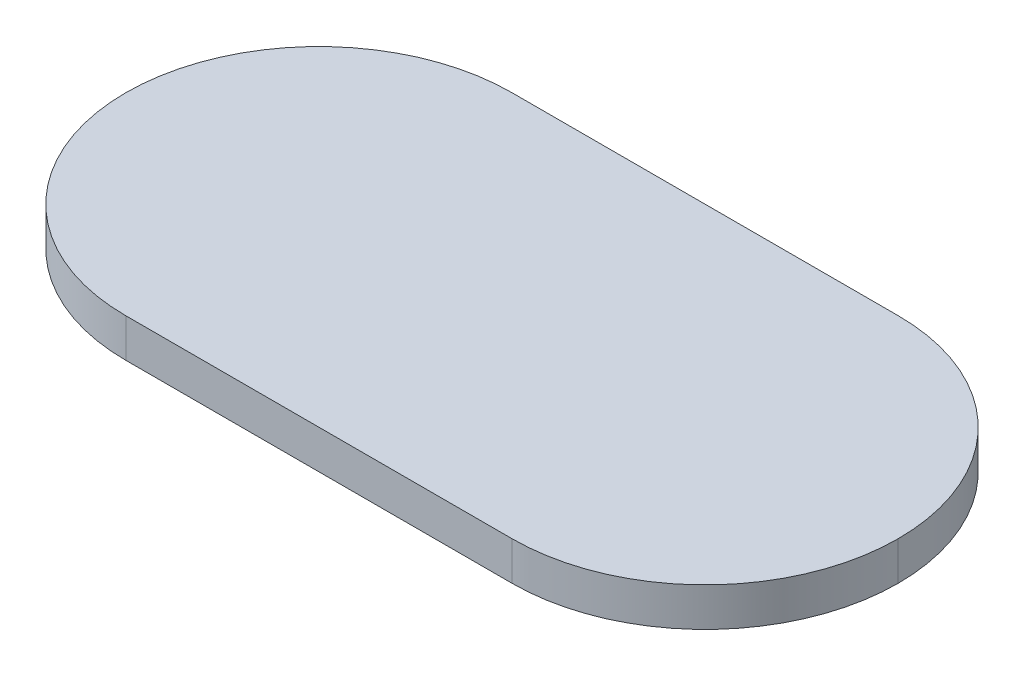
ISO-10303-21;
HEADER;
FILE_DESCRIPTION(('STEP AP214'),'2;1');
FILE_NAME('part.step','',(''),(''),'','','');
FILE_SCHEMA(('AUTOMOTIVE_DESIGN { 1 0 10303 214 1 1 1 1 }'));
ENDSEC;
DATA;
#1=APPLICATION_CONTEXT('core data for automotive mechanical design processes');
#2=APPLICATION_PROTOCOL_DEFINITION('international standard','automotive_design',2000,#1);
#3=PRODUCT_CONTEXT('',#1,'mechanical');
#4=PRODUCT('Part','Part','',(#3));
#5=PRODUCT_RELATED_PRODUCT_CATEGORY('part','',(#4));
#6=PRODUCT_DEFINITION_FORMATION('','',#4);
#7=PRODUCT_DEFINITION_CONTEXT('part definition',#1,'design');
#8=PRODUCT_DEFINITION('design','',#6,#7);
#9=PRODUCT_DEFINITION_SHAPE('','',#8);
#10=(LENGTH_UNIT() NAMED_UNIT(*) SI_UNIT(.MILLI.,.METRE.));
#11=(NAMED_UNIT(*) PLANE_ANGLE_UNIT() SI_UNIT($,.RADIAN.));
#12=(NAMED_UNIT(*) SI_UNIT($,.STERADIAN.) SOLID_ANGLE_UNIT());
#13=UNCERTAINTY_MEASURE_WITH_UNIT(LENGTH_MEASURE(1.E-05),#10,'distance_accuracy_value','');
#14=(GEOMETRIC_REPRESENTATION_CONTEXT(3) GLOBAL_UNCERTAINTY_ASSIGNED_CONTEXT((#13)) GLOBAL_UNIT_ASSIGNED_CONTEXT((#10,
#11,#12)) REPRESENTATION_CONTEXT('',''));
#15=CARTESIAN_POINT('',(0.,0.,0.));
#16=DIRECTION('',(0.,0.,1.));
#17=DIRECTION('',(1.,0.,0.));
#18=AXIS2_PLACEMENT_3D('',#15,#16,#17);
#19=CARTESIAN_POINT('',(-100.,10.,-50.));
#20=DIRECTION('',(0.,0.,1.));
#21=DIRECTION('',(1.,0.,0.));
#22=AXIS2_PLACEMENT_3D('',#19,#20,#21);
#23=PLANE('',#22);
#24=DIRECTION('',(-1.,0.,0.));
#25=VECTOR('',#24,1.);
#26=CARTESIAN_POINT('',(-100.,10.,-50.));
#27=LINE('',#26,#25);
#28=CARTESIAN_POINT('',(50.,10.,-50.));
#29=VERTEX_POINT('',#28);
#30=CARTESIAN_POINT('',(-50.,10.,-50.));
#31=VERTEX_POINT('',#30);
#32=EDGE_CURVE('E110',#29,#31,#27,.T.);
#33=ORIENTED_EDGE('',*,*,#32,.F.);
#34=DIRECTION('',(0.,-1.,0.));
#35=VECTOR('',#34,1.);
#36=CARTESIAN_POINT('',(50.,10.,-50.));
#37=LINE('',#36,#35);
#38=CARTESIAN_POINT('',(50.,0.,-50.));
#39=VERTEX_POINT('',#38);
#40=EDGE_CURVE('E95',#29,#39,#37,.T.);
#41=ORIENTED_EDGE('',*,*,#40,.T.);
#42=DIRECTION('',(-1.,0.,0.));
#43=VECTOR('',#42,1.);
#44=CARTESIAN_POINT('',(-100.,0.,-50.));
#45=LINE('',#44,#43);
#46=CARTESIAN_POINT('',(-50.,0.,-50.));
#47=VERTEX_POINT('',#46);
#48=EDGE_CURVE('E107',#39,#47,#45,.T.);
#49=ORIENTED_EDGE('',*,*,#48,.T.);
#50=DIRECTION('',(0.,-1.,0.));
#51=VECTOR('',#50,1.);
#52=CARTESIAN_POINT('',(-50.,10.,-50.));
#53=LINE('',#52,#51);
#54=EDGE_CURVE('E112',#47,#31,#53,.F.);
#55=ORIENTED_EDGE('',*,*,#54,.T.);
#56=EDGE_LOOP('',(#33,#41,#49,#55));
#57=FACE_BOUND('',#56,.T.);
#58=ADVANCED_FACE('F37',(#57),#23,.F.);
#59=CARTESIAN_POINT('',(-100.,10.,50.));
#60=DIRECTION('',(0.,0.,-1.));
#61=DIRECTION('',(-1.,0.,0.));
#62=AXIS2_PLACEMENT_3D('',#59,#60,#61);
#63=PLANE('',#62);
#64=DIRECTION('',(1.,0.,0.));
#65=VECTOR('',#64,1.);
#66=CARTESIAN_POINT('',(-100.,0.,50.));
#67=LINE('',#66,#65);
#68=CARTESIAN_POINT('',(-50.,0.,50.));
#69=VERTEX_POINT('',#68);
#70=CARTESIAN_POINT('',(50.,0.,50.));
#71=VERTEX_POINT('',#70);
#72=EDGE_CURVE('E116',#69,#71,#67,.T.);
#73=ORIENTED_EDGE('',*,*,#72,.T.);
#74=DIRECTION('',(0.,-1.,0.));
#75=VECTOR('',#74,1.);
#76=CARTESIAN_POINT('',(50.,10.,50.));
#77=LINE('',#76,#75);
#78=CARTESIAN_POINT('',(50.,10.,50.));
#79=VERTEX_POINT('',#78);
#80=EDGE_CURVE('E11',#71,#79,#77,.F.);
#81=ORIENTED_EDGE('',*,*,#80,.T.);
#82=DIRECTION('',(1.,0.,0.));
#83=VECTOR('',#82,1.);
#84=CARTESIAN_POINT('',(-100.,10.,50.));
#85=LINE('',#84,#83);
#86=CARTESIAN_POINT('',(-50.,10.,50.));
#87=VERTEX_POINT('',#86);
#88=EDGE_CURVE('E120',#87,#79,#85,.T.);
#89=ORIENTED_EDGE('',*,*,#88,.F.);
#90=DIRECTION('',(0.,-1.,0.));
#91=VECTOR('',#90,1.);
#92=CARTESIAN_POINT('',(-50.,10.,50.));
#93=LINE('',#92,#91);
#94=EDGE_CURVE('E46',#87,#69,#93,.T.);
#95=ORIENTED_EDGE('',*,*,#94,.T.);
#96=EDGE_LOOP('',(#73,#81,#89,#95));
#97=FACE_BOUND('',#96,.T.);
#98=ADVANCED_FACE('F137',(#97),#63,.F.);
#99=CARTESIAN_POINT('',(0.,10.,0.));
#100=DIRECTION('',(0.,1.,0.));
#101=DIRECTION('',(0.,0.,1.));
#102=AXIS2_PLACEMENT_3D('',#99,#100,#101);
#103=PLANE('',#102);
#104=CARTESIAN_POINT('',(50.,10.,0.));
#105=DIRECTION('',(0.,1.,0.));
#106=DIRECTION('',(0.,0.,1.));
#107=AXIS2_PLACEMENT_3D('',#104,#105,#106);
#108=CIRCLE('',#107,50.);
#109=CARTESIAN_POINT('',(100.,10.,0.));
#110=VERTEX_POINT('',#109);
#111=EDGE_CURVE('E130',#79,#110,#108,.T.);
#112=ORIENTED_EDGE('',*,*,#111,.T.);
#113=CARTESIAN_POINT('',(50.,10.,0.));
#114=DIRECTION('',(0.,1.,0.));
#115=DIRECTION('',(0.,0.,1.));
#116=AXIS2_PLACEMENT_3D('',#113,#114,#115);
#117=CIRCLE('',#116,50.);
#118=EDGE_CURVE('E132',#110,#29,#117,.T.);
#119=ORIENTED_EDGE('',*,*,#118,.T.);
#120=ORIENTED_EDGE('',*,*,#32,.T.);
#121=CARTESIAN_POINT('',(-50.,10.,0.));
#122=DIRECTION('',(0.,1.,0.));
#123=DIRECTION('',(0.,0.,1.));
#124=AXIS2_PLACEMENT_3D('',#121,#122,#123);
#125=CIRCLE('',#124,50.);
#126=CARTESIAN_POINT('',(-100.,10.,0.));
#127=VERTEX_POINT('',#126);
#128=EDGE_CURVE('E101',#31,#127,#125,.T.);
#129=ORIENTED_EDGE('',*,*,#128,.T.);
#130=CARTESIAN_POINT('',(-50.,10.,0.));
#131=DIRECTION('',(0.,1.,0.));
#132=DIRECTION('',(0.,0.,1.));
#133=AXIS2_PLACEMENT_3D('',#130,#131,#132);
#134=CIRCLE('',#133,50.);
#135=EDGE_CURVE('E59',#127,#87,#134,.T.);
#136=ORIENTED_EDGE('',*,*,#135,.T.);
#137=ORIENTED_EDGE('',*,*,#88,.T.);
#138=EDGE_LOOP('',(#112,#119,#120,#129,#136,#137));
#139=FACE_BOUND('',#138,.T.);
#140=ADVANCED_FACE('F142',(#139),#103,.T.);
#141=CARTESIAN_POINT('',(0.,0.,0.));
#142=DIRECTION('',(0.,1.,0.));
#143=DIRECTION('',(0.,0.,1.));
#144=AXIS2_PLACEMENT_3D('',#141,#142,#143);
#145=PLANE('',#144);
#146=ORIENTED_EDGE('',*,*,#48,.F.);
#147=CARTESIAN_POINT('',(50.,0.,0.));
#148=DIRECTION('',(0.,1.,0.));
#149=DIRECTION('',(0.,0.,1.));
#150=AXIS2_PLACEMENT_3D('',#147,#148,#149);
#151=CIRCLE('',#150,50.);
#152=CARTESIAN_POINT('',(100.,0.,0.));
#153=VERTEX_POINT('',#152);
#154=EDGE_CURVE('E91',#39,#153,#151,.F.);
#155=ORIENTED_EDGE('',*,*,#154,.T.);
#156=CARTESIAN_POINT('',(50.,0.,0.));
#157=DIRECTION('',(0.,1.,0.));
#158=DIRECTION('',(0.,0.,1.));
#159=AXIS2_PLACEMENT_3D('',#156,#157,#158);
#160=CIRCLE('',#159,50.);
#161=EDGE_CURVE('E102',#153,#71,#160,.F.);
#162=ORIENTED_EDGE('',*,*,#161,.T.);
#163=ORIENTED_EDGE('',*,*,#72,.F.);
#164=CARTESIAN_POINT('',(-50.,0.,0.));
#165=DIRECTION('',(0.,1.,0.));
#166=DIRECTION('',(0.,0.,1.));
#167=AXIS2_PLACEMENT_3D('',#164,#165,#166);
#168=CIRCLE('',#167,50.);
#169=CARTESIAN_POINT('',(-100.,0.,0.));
#170=VERTEX_POINT('',#169);
#171=EDGE_CURVE('E125',#69,#170,#168,.F.);
#172=ORIENTED_EDGE('',*,*,#171,.T.);
#173=CARTESIAN_POINT('',(-50.,0.,0.));
#174=DIRECTION('',(0.,1.,0.));
#175=DIRECTION('',(0.,0.,1.));
#176=AXIS2_PLACEMENT_3D('',#173,#174,#175);
#177=CIRCLE('',#176,50.);
#178=EDGE_CURVE('E111',#170,#47,#177,.F.);
#179=ORIENTED_EDGE('',*,*,#178,.T.);
#180=EDGE_LOOP('',(#146,#155,#162,#163,#172,#179));
#181=FACE_BOUND('',#180,.T.);
#182=ADVANCED_FACE('F114',(#181),#145,.F.);
#183=CARTESIAN_POINT('',(50.,10.,0.));
#184=DIRECTION('',(0.,-1.,0.));
#185=DIRECTION('',(0.,0.,-1.));
#186=AXIS2_PLACEMENT_3D('',#183,#184,#185);
#187=CYLINDRICAL_SURFACE('',#186,50.);
#188=DIRECTION('',(0.,-1.,0.));
#189=VECTOR('',#188,1.);
#190=CARTESIAN_POINT('',(100.,10.,0.));
#191=LINE('',#190,#189);
#192=EDGE_CURVE('E97',#110,#153,#191,.T.);
#193=ORIENTED_EDGE('',*,*,#192,.F.);
#194=ORIENTED_EDGE('',*,*,#111,.F.);
#195=ORIENTED_EDGE('',*,*,#80,.F.);
#196=ORIENTED_EDGE('',*,*,#161,.F.);
#197=EDGE_LOOP('',(#193,#194,#195,#196));
#198=FACE_BOUND('',#197,.T.);
#199=ADVANCED_FACE('F140',(#198),#187,.T.);
#200=CARTESIAN_POINT('',(50.,10.,0.));
#201=DIRECTION('',(0.,-1.,0.));
#202=DIRECTION('',(0.,0.,-1.));
#203=AXIS2_PLACEMENT_3D('',#200,#201,#202);
#204=CYLINDRICAL_SURFACE('',#203,50.);
#205=ORIENTED_EDGE('',*,*,#118,.F.);
#206=ORIENTED_EDGE('',*,*,#192,.T.);
#207=ORIENTED_EDGE('',*,*,#154,.F.);
#208=ORIENTED_EDGE('',*,*,#40,.F.);
#209=EDGE_LOOP('',(#205,#206,#207,#208));
#210=FACE_BOUND('',#209,.T.);
#211=ADVANCED_FACE('F94',(#210),#204,.T.);
#212=CARTESIAN_POINT('',(-50.,10.,0.));
#213=DIRECTION('',(0.,-1.,0.));
#214=DIRECTION('',(0.,0.,-1.));
#215=AXIS2_PLACEMENT_3D('',#212,#213,#214);
#216=CYLINDRICAL_SURFACE('',#215,50.);
#217=DIRECTION('',(0.,-1.,0.));
#218=VECTOR('',#217,1.);
#219=CARTESIAN_POINT('',(-100.,10.,0.));
#220=LINE('',#219,#218);
#221=EDGE_CURVE('E41',#127,#170,#220,.T.);
#222=ORIENTED_EDGE('',*,*,#221,.F.);
#223=ORIENTED_EDGE('',*,*,#128,.F.);
#224=ORIENTED_EDGE('',*,*,#54,.F.);
#225=ORIENTED_EDGE('',*,*,#178,.F.);
#226=EDGE_LOOP('',(#222,#223,#224,#225));
#227=FACE_BOUND('',#226,.T.);
#228=ADVANCED_FACE('F39',(#227),#216,.T.);
#229=CARTESIAN_POINT('',(-50.,10.,0.));
#230=DIRECTION('',(0.,-1.,0.));
#231=DIRECTION('',(0.,0.,-1.));
#232=AXIS2_PLACEMENT_3D('',#229,#230,#231);
#233=CYLINDRICAL_SURFACE('',#232,50.);
#234=ORIENTED_EDGE('',*,*,#135,.F.);
#235=ORIENTED_EDGE('',*,*,#221,.T.);
#236=ORIENTED_EDGE('',*,*,#171,.F.);
#237=ORIENTED_EDGE('',*,*,#94,.F.);
#238=EDGE_LOOP('',(#234,#235,#236,#237));
#239=FACE_BOUND('',#238,.T.);
#240=ADVANCED_FACE('F147',(#239),#233,.T.);
#241=CLOSED_SHELL('',(#58,#98,#140,#182,#199,#211,#228,#240));
#242=MANIFOLD_SOLID_BREP('B2',#241);
#243=ADVANCED_BREP_SHAPE_REPRESENTATION('',(#18,#242),#14);
#244=SHAPE_DEFINITION_REPRESENTATION(#9,#243);
ENDSEC;
END-ISO-10303-21;
